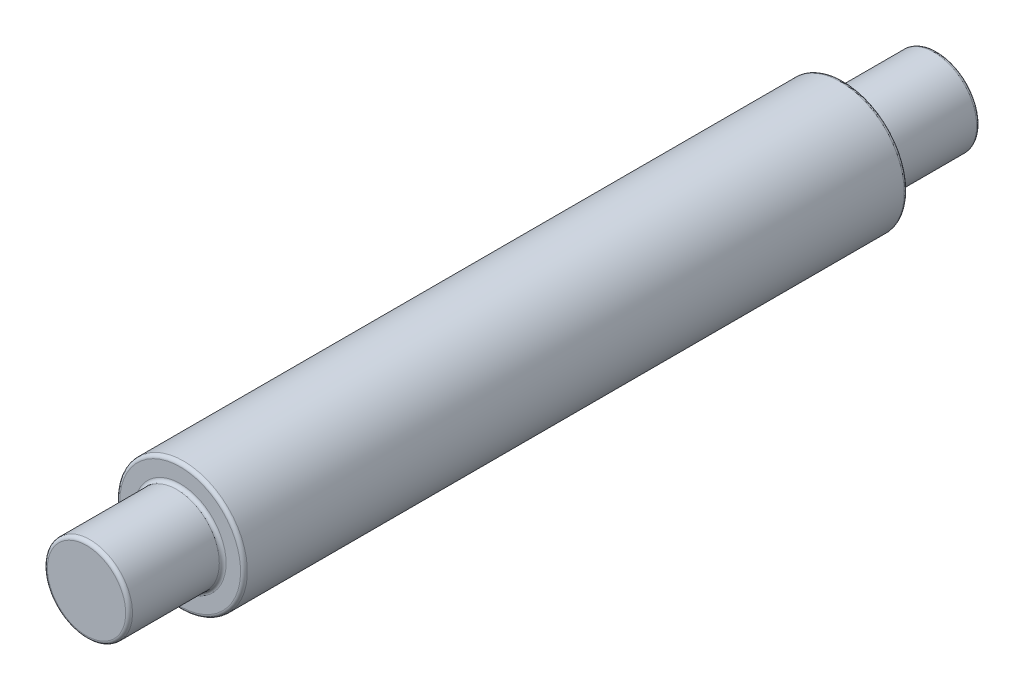
ISO-10303-21;
HEADER;
FILE_DESCRIPTION(('STEP AP214'),'2;1');
FILE_NAME('part.step','',(''),(''),'','','');
FILE_SCHEMA(('AUTOMOTIVE_DESIGN { 1 0 10303 214 1 1 1 1 }'));
ENDSEC;
DATA;
#1=APPLICATION_CONTEXT('core data for automotive mechanical design processes');
#2=APPLICATION_PROTOCOL_DEFINITION('international standard','automotive_design',2000,#1);
#3=PRODUCT_CONTEXT('',#1,'mechanical');
#4=PRODUCT('Part','Part','',(#3));
#5=PRODUCT_RELATED_PRODUCT_CATEGORY('part','',(#4));
#6=PRODUCT_DEFINITION_FORMATION('','',#4);
#7=PRODUCT_DEFINITION_CONTEXT('part definition',#1,'design');
#8=PRODUCT_DEFINITION('design','',#6,#7);
#9=PRODUCT_DEFINITION_SHAPE('','',#8);
#10=(LENGTH_UNIT() NAMED_UNIT(*) SI_UNIT(.MILLI.,.METRE.));
#11=(NAMED_UNIT(*) PLANE_ANGLE_UNIT() SI_UNIT($,.RADIAN.));
#12=(NAMED_UNIT(*) SI_UNIT($,.STERADIAN.) SOLID_ANGLE_UNIT());
#13=UNCERTAINTY_MEASURE_WITH_UNIT(LENGTH_MEASURE(1.E-05),#10,'distance_accuracy_value','');
#14=(GEOMETRIC_REPRESENTATION_CONTEXT(3) GLOBAL_UNCERTAINTY_ASSIGNED_CONTEXT((#13)) GLOBAL_UNIT_ASSIGNED_CONTEXT((#10,
#11,#12)) REPRESENTATION_CONTEXT('',''));
#15=CARTESIAN_POINT('',(0.,0.,0.));
#16=DIRECTION('',(0.,0.,1.));
#17=DIRECTION('',(1.,0.,0.));
#18=AXIS2_PLACEMENT_3D('',#15,#16,#17);
#19=CARTESIAN_POINT('',(0.,0.,12.5));
#20=DIRECTION('',(0.,0.,1.));
#21=DIRECTION('',(1.,0.,0.));
#22=AXIS2_PLACEMENT_3D('',#19,#20,#21);
#23=PLANE('',#22);
#24=CARTESIAN_POINT('',(0.,0.,12.5));
#25=DIRECTION('',(0.,0.,-1.));
#26=DIRECTION('',(-1.,0.,0.));
#27=AXIS2_PLACEMENT_3D('',#24,#25,#26);
#28=CIRCLE('',#27,1.15);
#29=CARTESIAN_POINT('',(-1.15,0.,12.5));
#30=VERTEX_POINT('',#29);
#31=EDGE_CURVE('E28',#30,#30,#28,.T.);
#32=ORIENTED_EDGE('',*,*,#31,.F.);
#33=EDGE_LOOP('',(#32));
#34=FACE_BOUND('',#33,.T.);
#35=ADVANCED_FACE('F17',(#34),#23,.T.);
#36=CARTESIAN_POINT('',(0.,0.,12.4));
#37=DIRECTION('',(0.,0.,1.));
#38=DIRECTION('',(1.,0.,0.));
#39=AXIS2_PLACEMENT_3D('',#36,#37,#38);
#40=TOROIDAL_SURFACE('',#39,1.15,0.1);
#41=ORIENTED_EDGE('',*,*,#31,.T.);
#42=CARTESIAN_POINT('',(-1.15,0.,12.4));
#43=DIRECTION('',(0.,-1.,0.));
#44=DIRECTION('',(-1.,0.,0.));
#45=AXIS2_PLACEMENT_3D('',#42,#43,#44);
#46=CIRCLE('',#45,0.1);
#47=CARTESIAN_POINT('',(-1.25,0.,12.4));
#48=VERTEX_POINT('',#47);
#49=EDGE_CURVE('E11',#30,#48,#46,.T.);
#50=ORIENTED_EDGE('',*,*,#49,.T.);
#51=CARTESIAN_POINT('',(0.,0.,12.4));
#52=DIRECTION('',(0.,0.,1.));
#53=DIRECTION('',(-1.,0.,0.));
#54=AXIS2_PLACEMENT_3D('',#51,#52,#53);
#55=CIRCLE('',#54,1.25);
#56=EDGE_CURVE('E161',#48,#48,#55,.T.);
#57=ORIENTED_EDGE('',*,*,#56,.T.);
#58=ORIENTED_EDGE('',*,*,#49,.F.);
#59=EDGE_LOOP('',(#41,#50,#57,#58));
#60=FACE_BOUND('',#59,.T.);
#61=ADVANCED_FACE('F229',(#60),#40,.T.);
#62=CARTESIAN_POINT('',(0.,0.,0.));
#63=DIRECTION('',(0.,0.,1.));
#64=DIRECTION('',(1.,0.,0.));
#65=AXIS2_PLACEMENT_3D('',#62,#63,#64);
#66=CYLINDRICAL_SURFACE('',#65,1.25);
#67=ORIENTED_EDGE('',*,*,#56,.F.);
#68=DIRECTION('',(0.,0.,-1.));
#69=VECTOR('',#68,1.);
#70=CARTESIAN_POINT('',(-1.25,0.,0.));
#71=LINE('',#70,#69);
#72=CARTESIAN_POINT('',(-1.25,0.,9.85));
#73=VERTEX_POINT('',#72);
#74=EDGE_CURVE('E156',#48,#73,#71,.T.);
#75=ORIENTED_EDGE('',*,*,#74,.T.);
#76=CARTESIAN_POINT('',(0.,0.,9.85));
#77=DIRECTION('',(0.,0.,-1.));
#78=DIRECTION('',(1.,0.,0.));
#79=AXIS2_PLACEMENT_3D('',#76,#77,#78);
#80=CIRCLE('',#79,1.25);
#81=CARTESIAN_POINT('',(1.25,0.,9.85));
#82=VERTEX_POINT('',#81);
#83=EDGE_CURVE('E170',#82,#73,#80,.T.);
#84=ORIENTED_EDGE('',*,*,#83,.F.);
#85=CARTESIAN_POINT('',(0.,0.,9.85));
#86=DIRECTION('',(0.,0.,-1.));
#87=DIRECTION('',(1.,0.,0.));
#88=AXIS2_PLACEMENT_3D('',#85,#86,#87);
#89=CIRCLE('',#88,1.25);
#90=EDGE_CURVE('E193',#73,#82,#89,.T.);
#91=ORIENTED_EDGE('',*,*,#90,.F.);
#92=ORIENTED_EDGE('',*,*,#74,.F.);
#93=EDGE_LOOP('',(#67,#75,#84,#91,#92));
#94=FACE_BOUND('',#93,.T.);
#95=ADVANCED_FACE('F236',(#94),#66,.T.);
#96=CARTESIAN_POINT('',(0.,0.,9.85));
#97=DIRECTION('',(0.,0.,-1.));
#98=DIRECTION('',(-1.,0.,0.));
#99=AXIS2_PLACEMENT_3D('',#96,#97,#98);
#100=TOROIDAL_SURFACE('',#99,1.35,0.1);
#101=ORIENTED_EDGE('',*,*,#90,.T.);
#102=CARTESIAN_POINT('',(1.35,0.,9.85));
#103=DIRECTION('',(0.,-1.,0.));
#104=DIRECTION('',(1.,0.,0.));
#105=AXIS2_PLACEMENT_3D('',#102,#103,#104);
#106=CIRCLE('',#105,0.1);
#107=CARTESIAN_POINT('',(1.35,0.,9.75));
#108=VERTEX_POINT('',#107);
#109=EDGE_CURVE('E174',#82,#108,#106,.T.);
#110=ORIENTED_EDGE('',*,*,#109,.T.);
#111=CARTESIAN_POINT('',(0.,0.,9.75));
#112=DIRECTION('',(0.,0.,1.));
#113=DIRECTION('',(1.,0.,0.));
#114=AXIS2_PLACEMENT_3D('',#111,#112,#113);
#115=CIRCLE('',#114,1.35);
#116=EDGE_CURVE('E129',#108,#108,#115,.T.);
#117=ORIENTED_EDGE('',*,*,#116,.T.);
#118=ORIENTED_EDGE('',*,*,#109,.F.);
#119=ORIENTED_EDGE('',*,*,#83,.T.);
#120=EDGE_LOOP('',(#101,#110,#117,#118,#119));
#121=FACE_BOUND('',#120,.T.);
#122=ADVANCED_FACE('F240',(#121),#100,.F.);
#123=CARTESIAN_POINT('',(0.,0.,9.75));
#124=DIRECTION('',(0.,0.,1.));
#125=DIRECTION('',(1.,0.,0.));
#126=AXIS2_PLACEMENT_3D('',#123,#124,#125);
#127=PLANE('',#126);
#128=ORIENTED_EDGE('',*,*,#116,.F.);
#129=EDGE_LOOP('',(#128));
#130=FACE_BOUND('',#129,.T.);
#131=CARTESIAN_POINT('',(0.,0.,9.75));
#132=DIRECTION('',(0.,0.,-1.));
#133=DIRECTION('',(-1.,0.,0.));
#134=AXIS2_PLACEMENT_3D('',#131,#132,#133);
#135=CIRCLE('',#134,1.775);
#136=CARTESIAN_POINT('',(-1.775,0.,9.75));
#137=VERTEX_POINT('',#136);
#138=EDGE_CURVE('E119',#137,#137,#135,.T.);
#139=ORIENTED_EDGE('',*,*,#138,.F.);
#140=EDGE_LOOP('',(#139));
#141=FACE_BOUND('',#140,.T.);
#142=ADVANCED_FACE('F19',(#130,#141),#127,.T.);
#143=CARTESIAN_POINT('',(0.,0.,9.65));
#144=DIRECTION('',(0.,0.,1.));
#145=DIRECTION('',(1.,0.,0.));
#146=AXIS2_PLACEMENT_3D('',#143,#144,#145);
#147=TOROIDAL_SURFACE('',#146,1.775,0.1);
#148=ORIENTED_EDGE('',*,*,#138,.T.);
#149=CARTESIAN_POINT('',(-1.775,0.,9.65));
#150=DIRECTION('',(0.,-1.,0.));
#151=DIRECTION('',(-1.,0.,0.));
#152=AXIS2_PLACEMENT_3D('',#149,#150,#151);
#153=CIRCLE('',#152,0.1);
#154=CARTESIAN_POINT('',(-1.875,0.,9.65));
#155=VERTEX_POINT('',#154);
#156=EDGE_CURVE('E122',#137,#155,#153,.T.);
#157=ORIENTED_EDGE('',*,*,#156,.T.);
#158=CARTESIAN_POINT('',(0.,0.,9.65));
#159=DIRECTION('',(0.,0.,1.));
#160=DIRECTION('',(-1.,0.,0.));
#161=AXIS2_PLACEMENT_3D('',#158,#159,#160);
#162=CIRCLE('',#161,1.875);
#163=EDGE_CURVE('E131',#155,#155,#162,.T.);
#164=ORIENTED_EDGE('',*,*,#163,.T.);
#165=ORIENTED_EDGE('',*,*,#156,.F.);
#166=EDGE_LOOP('',(#148,#157,#164,#165));
#167=FACE_BOUND('',#166,.T.);
#168=ADVANCED_FACE('F216',(#167),#147,.T.);
#169=CARTESIAN_POINT('',(0.,0.,0.));
#170=DIRECTION('',(0.,0.,1.));
#171=DIRECTION('',(1.,0.,0.));
#172=AXIS2_PLACEMENT_3D('',#169,#170,#171);
#173=CYLINDRICAL_SURFACE('',#172,1.875);
#174=ORIENTED_EDGE('',*,*,#163,.F.);
#175=DIRECTION('',(0.,0.,-1.));
#176=VECTOR('',#175,1.);
#177=CARTESIAN_POINT('',(-1.875,0.,0.));
#178=LINE('',#177,#176);
#179=CARTESIAN_POINT('',(-1.875,0.,-9.65));
#180=VERTEX_POINT('',#179);
#181=EDGE_CURVE('E21',#155,#180,#178,.T.);
#182=ORIENTED_EDGE('',*,*,#181,.T.);
#183=CARTESIAN_POINT('',(0.,0.,-9.65));
#184=DIRECTION('',(0.,0.,-1.));
#185=DIRECTION('',(-1.,0.,0.));
#186=AXIS2_PLACEMENT_3D('',#183,#184,#185);
#187=CIRCLE('',#186,1.875);
#188=CARTESIAN_POINT('',(1.875,0.,-9.65));
#189=VERTEX_POINT('',#188);
#190=EDGE_CURVE('E146',#189,#180,#187,.T.);
#191=ORIENTED_EDGE('',*,*,#190,.F.);
#192=CARTESIAN_POINT('',(0.,0.,-9.65));
#193=DIRECTION('',(0.,0.,-1.));
#194=DIRECTION('',(-1.,0.,0.));
#195=AXIS2_PLACEMENT_3D('',#192,#193,#194);
#196=CIRCLE('',#195,1.875);
#197=EDGE_CURVE('E141',#180,#189,#196,.T.);
#198=ORIENTED_EDGE('',*,*,#197,.F.);
#199=ORIENTED_EDGE('',*,*,#181,.F.);
#200=EDGE_LOOP('',(#174,#182,#191,#198,#199));
#201=FACE_BOUND('',#200,.T.);
#202=ADVANCED_FACE('F214',(#201),#173,.T.);
#203=CARTESIAN_POINT('',(0.,0.,-9.65));
#204=DIRECTION('',(0.,0.,-1.));
#205=DIRECTION('',(-1.,0.,0.));
#206=AXIS2_PLACEMENT_3D('',#203,#204,#205);
#207=TOROIDAL_SURFACE('',#206,1.775,0.1);
#208=CARTESIAN_POINT('',(0.,0.,-9.75));
#209=DIRECTION('',(0.,0.,1.));
#210=DIRECTION('',(-1.,0.,0.));
#211=AXIS2_PLACEMENT_3D('',#208,#209,#210);
#212=CIRCLE('',#211,1.775);
#213=CARTESIAN_POINT('',(1.775,0.,-9.75));
#214=VERTEX_POINT('',#213);
#215=EDGE_CURVE('E108',#214,#214,#212,.T.);
#216=ORIENTED_EDGE('',*,*,#215,.T.);
#217=CARTESIAN_POINT('',(1.775,0.,-9.65));
#218=DIRECTION('',(0.,-1.,0.));
#219=DIRECTION('',(1.,0.,0.));
#220=AXIS2_PLACEMENT_3D('',#217,#218,#219);
#221=CIRCLE('',#220,0.1);
#222=EDGE_CURVE('E93',#214,#189,#221,.T.);
#223=ORIENTED_EDGE('',*,*,#222,.T.);
#224=ORIENTED_EDGE('',*,*,#190,.T.);
#225=ORIENTED_EDGE('',*,*,#197,.T.);
#226=ORIENTED_EDGE('',*,*,#222,.F.);
#227=EDGE_LOOP('',(#216,#223,#224,#225,#226));
#228=FACE_BOUND('',#227,.T.);
#229=ADVANCED_FACE('F213',(#228),#207,.T.);
#230=CARTESIAN_POINT('',(0.,0.,-9.75));
#231=DIRECTION('',(0.,0.,1.));
#232=DIRECTION('',(1.,0.,0.));
#233=AXIS2_PLACEMENT_3D('',#230,#231,#232);
#234=PLANE('',#233);
#235=CARTESIAN_POINT('',(0.,0.,-9.75));
#236=DIRECTION('',(0.,0.,-1.));
#237=DIRECTION('',(1.,0.,0.));
#238=AXIS2_PLACEMENT_3D('',#235,#236,#237);
#239=CIRCLE('',#238,1.35);
#240=CARTESIAN_POINT('',(-1.35,0.,-9.75));
#241=VERTEX_POINT('',#240);
#242=EDGE_CURVE('E101',#241,#241,#239,.T.);
#243=ORIENTED_EDGE('',*,*,#242,.F.);
#244=EDGE_LOOP('',(#243));
#245=FACE_BOUND('',#244,.T.);
#246=ORIENTED_EDGE('',*,*,#215,.F.);
#247=EDGE_LOOP('',(#246));
#248=FACE_BOUND('',#247,.T.);
#249=ADVANCED_FACE('F224',(#245,#248),#234,.F.);
#250=CARTESIAN_POINT('',(0.,0.,-9.85));
#251=DIRECTION('',(0.,0.,1.));
#252=DIRECTION('',(1.,0.,0.));
#253=AXIS2_PLACEMENT_3D('',#250,#251,#252);
#254=TOROIDAL_SURFACE('',#253,1.35,0.1);
#255=CARTESIAN_POINT('',(0.,0.,-9.85));
#256=DIRECTION('',(0.,0.,1.));
#257=DIRECTION('',(1.,0.,0.));
#258=AXIS2_PLACEMENT_3D('',#255,#256,#257);
#259=CIRCLE('',#258,1.25);
#260=CARTESIAN_POINT('',(-1.25,0.,-9.85));
#261=VERTEX_POINT('',#260);
#262=EDGE_CURVE('E153',#261,#261,#259,.T.);
#263=ORIENTED_EDGE('',*,*,#262,.T.);
#264=CARTESIAN_POINT('',(-1.35,0.,-9.85));
#265=DIRECTION('',(0.,-1.,0.));
#266=DIRECTION('',(-1.,0.,0.));
#267=AXIS2_PLACEMENT_3D('',#264,#265,#266);
#268=CIRCLE('',#267,0.1);
#269=EDGE_CURVE('E104',#261,#241,#268,.T.);
#270=ORIENTED_EDGE('',*,*,#269,.T.);
#271=ORIENTED_EDGE('',*,*,#242,.T.);
#272=ORIENTED_EDGE('',*,*,#269,.F.);
#273=EDGE_LOOP('',(#263,#270,#271,#272));
#274=FACE_BOUND('',#273,.T.);
#275=ADVANCED_FACE('F103',(#274),#254,.F.);
#276=CARTESIAN_POINT('',(0.,0.,-12.5));
#277=DIRECTION('',(0.,0.,1.));
#278=DIRECTION('',(1.,0.,0.));
#279=AXIS2_PLACEMENT_3D('',#276,#277,#278);
#280=PLANE('',#279);
#281=CARTESIAN_POINT('',(0.,0.,-12.5));
#282=DIRECTION('',(0.,0.,1.));
#283=DIRECTION('',(-1.,0.,0.));
#284=AXIS2_PLACEMENT_3D('',#281,#282,#283);
#285=CIRCLE('',#284,1.15);
#286=CARTESIAN_POINT('',(1.15,0.,-12.5));
#287=VERTEX_POINT('',#286);
#288=EDGE_CURVE('E176',#287,#287,#285,.T.);
#289=ORIENTED_EDGE('',*,*,#288,.F.);
#290=EDGE_LOOP('',(#289));
#291=FACE_BOUND('',#290,.T.);
#292=ADVANCED_FACE('F245',(#291),#280,.F.);
#293=CARTESIAN_POINT('',(0.,0.,0.));
#294=DIRECTION('',(0.,0.,1.));
#295=DIRECTION('',(1.,0.,0.));
#296=AXIS2_PLACEMENT_3D('',#293,#294,#295);
#297=CYLINDRICAL_SURFACE('',#296,1.25);
#298=ORIENTED_EDGE('',*,*,#262,.F.);
#299=DIRECTION('',(0.,0.,-1.));
#300=VECTOR('',#299,1.);
#301=CARTESIAN_POINT('',(-1.25,0.,0.));
#302=LINE('',#301,#300);
#303=CARTESIAN_POINT('',(-1.25,0.,-12.4));
#304=VERTEX_POINT('',#303);
#305=EDGE_CURVE('E116',#261,#304,#302,.T.);
#306=ORIENTED_EDGE('',*,*,#305,.T.);
#307=CARTESIAN_POINT('',(0.,0.,-12.4));
#308=DIRECTION('',(0.,0.,-1.));
#309=DIRECTION('',(-1.,0.,0.));
#310=AXIS2_PLACEMENT_3D('',#307,#308,#309);
#311=CIRCLE('',#310,1.25);
#312=CARTESIAN_POINT('',(1.25,0.,-12.4));
#313=VERTEX_POINT('',#312);
#314=EDGE_CURVE('E154',#313,#304,#311,.T.);
#315=ORIENTED_EDGE('',*,*,#314,.F.);
#316=CARTESIAN_POINT('',(0.,0.,-12.4));
#317=DIRECTION('',(0.,0.,-1.));
#318=DIRECTION('',(-1.,0.,0.));
#319=AXIS2_PLACEMENT_3D('',#316,#317,#318);
#320=CIRCLE('',#319,1.25);
#321=EDGE_CURVE('E151',#304,#313,#320,.T.);
#322=ORIENTED_EDGE('',*,*,#321,.F.);
#323=ORIENTED_EDGE('',*,*,#305,.F.);
#324=EDGE_LOOP('',(#298,#306,#315,#322,#323));
#325=FACE_BOUND('',#324,.T.);
#326=ADVANCED_FACE('F250',(#325),#297,.T.);
#327=CARTESIAN_POINT('',(0.,0.,-12.4));
#328=DIRECTION('',(0.,0.,-1.));
#329=DIRECTION('',(-1.,0.,0.));
#330=AXIS2_PLACEMENT_3D('',#327,#328,#329);
#331=TOROIDAL_SURFACE('',#330,1.15,0.1);
#332=ORIENTED_EDGE('',*,*,#288,.T.);
#333=CARTESIAN_POINT('',(1.15,0.,-12.4));
#334=DIRECTION('',(0.,-1.,0.));
#335=DIRECTION('',(1.,0.,0.));
#336=AXIS2_PLACEMENT_3D('',#333,#334,#335);
#337=CIRCLE('',#336,0.1);
#338=EDGE_CURVE('E180',#287,#313,#337,.T.);
#339=ORIENTED_EDGE('',*,*,#338,.T.);
#340=ORIENTED_EDGE('',*,*,#314,.T.);
#341=ORIENTED_EDGE('',*,*,#321,.T.);
#342=ORIENTED_EDGE('',*,*,#338,.F.);
#343=EDGE_LOOP('',(#332,#339,#340,#341,#342));
#344=FACE_BOUND('',#343,.T.);
#345=ADVANCED_FACE('F257',(#344),#331,.T.);
#346=CLOSED_SHELL('',(#35,#61,#95,#122,#142,#168,#202,#229,#249,#275,#292,#326,#345));
#347=MANIFOLD_SOLID_BREP('B1',#346);
#348=ADVANCED_BREP_SHAPE_REPRESENTATION('',(#18,#347),#14);
#349=SHAPE_DEFINITION_REPRESENTATION(#9,#348);
ENDSEC;
END-ISO-10303-21;
